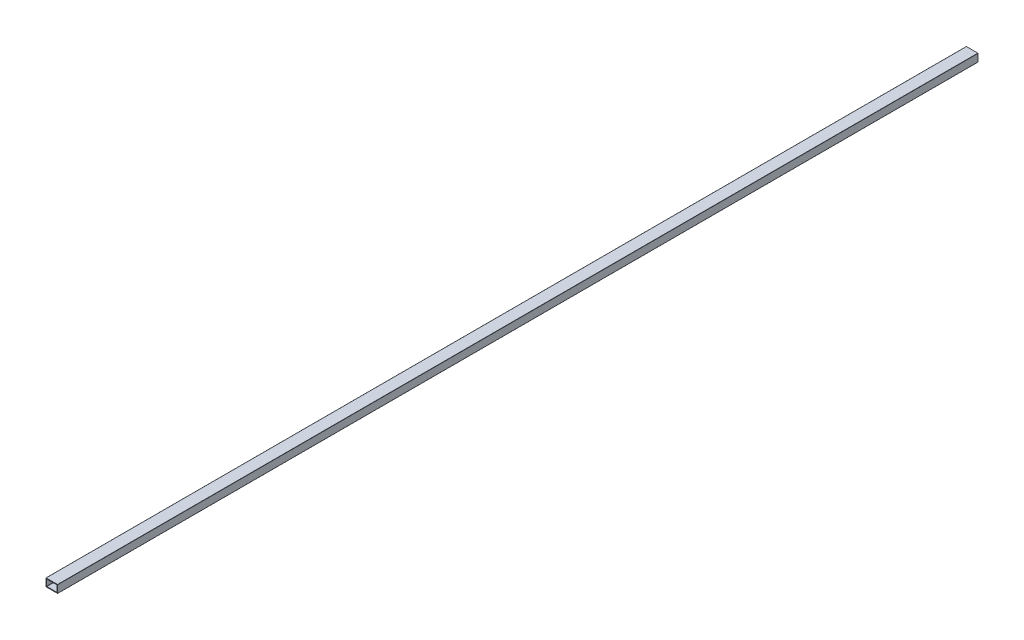
ISO-10303-21;
HEADER;
FILE_DESCRIPTION(('STEP AP214'),'2;1');
FILE_NAME('part.step','',(''),(''),'','','');
FILE_SCHEMA(('AUTOMOTIVE_DESIGN { 1 0 10303 214 1 1 1 1 }'));
ENDSEC;
DATA;
#1=APPLICATION_CONTEXT('core data for automotive mechanical design processes');
#2=APPLICATION_PROTOCOL_DEFINITION('international standard','automotive_design',2000,#1);
#3=PRODUCT_CONTEXT('',#1,'mechanical');
#4=PRODUCT('Part','Part','',(#3));
#5=PRODUCT_RELATED_PRODUCT_CATEGORY('part','',(#4));
#6=PRODUCT_DEFINITION_FORMATION('','',#4);
#7=PRODUCT_DEFINITION_CONTEXT('part definition',#1,'design');
#8=PRODUCT_DEFINITION('design','',#6,#7);
#9=PRODUCT_DEFINITION_SHAPE('','',#8);
#10=(LENGTH_UNIT() NAMED_UNIT(*) SI_UNIT(.MILLI.,.METRE.));
#11=(NAMED_UNIT(*) PLANE_ANGLE_UNIT() SI_UNIT($,.RADIAN.));
#12=(NAMED_UNIT(*) SI_UNIT($,.STERADIAN.) SOLID_ANGLE_UNIT());
#13=UNCERTAINTY_MEASURE_WITH_UNIT(LENGTH_MEASURE(1.E-05),#10,'distance_accuracy_value','');
#14=(GEOMETRIC_REPRESENTATION_CONTEXT(3) GLOBAL_UNCERTAINTY_ASSIGNED_CONTEXT((#13)) GLOBAL_UNIT_ASSIGNED_CONTEXT((#10,
#11,#12)) REPRESENTATION_CONTEXT('',''));
#15=CARTESIAN_POINT('',(0.,0.,0.));
#16=DIRECTION('',(0.,0.,1.));
#17=DIRECTION('',(1.,0.,0.));
#18=AXIS2_PLACEMENT_3D('',#15,#16,#17);
#19=CARTESIAN_POINT('',(38.1,-25.4,-6000.));
#20=DIRECTION('',(1.,0.,0.));
#21=DIRECTION('',(0.,0.,-1.));
#22=AXIS2_PLACEMENT_3D('',#19,#20,#21);
#23=PLANE('',#22);
#24=DIRECTION('',(0.,1.,0.));
#25=VECTOR('',#24,1.);
#26=CARTESIAN_POINT('',(38.1,-25.4,0.));
#27=LINE('',#26,#25);
#28=CARTESIAN_POINT('',(38.1,-24.4,0.));
#29=VERTEX_POINT('',#28);
#30=CARTESIAN_POINT('',(38.1,24.4,0.));
#31=VERTEX_POINT('',#30);
#32=EDGE_CURVE('E197',#29,#31,#27,.T.);
#33=ORIENTED_EDGE('',*,*,#32,.F.);
#34=DIRECTION('',(0.,0.,1.));
#35=VECTOR('',#34,1.);
#36=CARTESIAN_POINT('',(38.1,-24.4,-6000.));
#37=LINE('',#36,#35);
#38=CARTESIAN_POINT('',(38.1,-24.4,-6000.));
#39=VERTEX_POINT('',#38);
#40=EDGE_CURVE('E158',#29,#39,#37,.F.);
#41=ORIENTED_EDGE('',*,*,#40,.T.);
#42=DIRECTION('',(0.,1.,0.));
#43=VECTOR('',#42,1.);
#44=CARTESIAN_POINT('',(38.1,-25.4,-6000.));
#45=LINE('',#44,#43);
#46=CARTESIAN_POINT('',(38.1,24.4,-6000.));
#47=VERTEX_POINT('',#46);
#48=EDGE_CURVE('E185',#39,#47,#45,.T.);
#49=ORIENTED_EDGE('',*,*,#48,.T.);
#50=DIRECTION('',(0.,0.,1.));
#51=VECTOR('',#50,1.);
#52=CARTESIAN_POINT('',(38.1,24.4,-6000.));
#53=LINE('',#52,#51);
#54=EDGE_CURVE('E251',#47,#31,#53,.T.);
#55=ORIENTED_EDGE('',*,*,#54,.T.);
#56=EDGE_LOOP('',(#33,#41,#49,#55));
#57=FACE_BOUND('',#56,.T.);
#58=ADVANCED_FACE('F33',(#57),#23,.T.);
#59=CARTESIAN_POINT('',(-38.1,-25.4,-6000.));
#60=DIRECTION('',(0.,-1.,0.));
#61=DIRECTION('',(0.,0.,-1.));
#62=AXIS2_PLACEMENT_3D('',#59,#60,#61);
#63=PLANE('',#62);
#64=DIRECTION('',(1.,0.,0.));
#65=VECTOR('',#64,1.);
#66=CARTESIAN_POINT('',(-38.1,-25.4,0.));
#67=LINE('',#66,#65);
#68=CARTESIAN_POINT('',(-37.1,-25.4,0.));
#69=VERTEX_POINT('',#68);
#70=CARTESIAN_POINT('',(37.1,-25.4,0.));
#71=VERTEX_POINT('',#70);
#72=EDGE_CURVE('E189',#69,#71,#67,.T.);
#73=ORIENTED_EDGE('',*,*,#72,.F.);
#74=DIRECTION('',(0.,0.,1.));
#75=VECTOR('',#74,1.);
#76=CARTESIAN_POINT('',(-37.1,-25.4,-6000.));
#77=LINE('',#76,#75);
#78=CARTESIAN_POINT('',(-37.1,-25.4,-6000.));
#79=VERTEX_POINT('',#78);
#80=EDGE_CURVE('E238',#69,#79,#77,.F.);
#81=ORIENTED_EDGE('',*,*,#80,.T.);
#82=DIRECTION('',(1.,0.,0.));
#83=VECTOR('',#82,1.);
#84=CARTESIAN_POINT('',(-38.1,-25.4,-6000.));
#85=LINE('',#84,#83);
#86=CARTESIAN_POINT('',(37.1,-25.4,-6000.));
#87=VERTEX_POINT('',#86);
#88=EDGE_CURVE('E194',#79,#87,#85,.T.);
#89=ORIENTED_EDGE('',*,*,#88,.T.);
#90=DIRECTION('',(0.,0.,1.));
#91=VECTOR('',#90,1.);
#92=CARTESIAN_POINT('',(37.1,-25.4,-6000.));
#93=LINE('',#92,#91);
#94=EDGE_CURVE('E235',#87,#71,#93,.T.);
#95=ORIENTED_EDGE('',*,*,#94,.T.);
#96=EDGE_LOOP('',(#73,#81,#89,#95));
#97=FACE_BOUND('',#96,.T.);
#98=ADVANCED_FACE('F305',(#97),#63,.T.);
#99=CARTESIAN_POINT('',(-38.1,-25.4,-6000.));
#100=DIRECTION('',(-1.,0.,0.));
#101=DIRECTION('',(0.,0.,1.));
#102=AXIS2_PLACEMENT_3D('',#99,#100,#101);
#103=PLANE('',#102);
#104=DIRECTION('',(0.,-1.,0.));
#105=VECTOR('',#104,1.);
#106=CARTESIAN_POINT('',(-38.1,-25.4,-6000.));
#107=LINE('',#106,#105);
#108=CARTESIAN_POINT('',(-38.1,24.4,-6000.));
#109=VERTEX_POINT('',#108);
#110=CARTESIAN_POINT('',(-38.1,-24.4,-6000.));
#111=VERTEX_POINT('',#110);
#112=EDGE_CURVE('E191',#109,#111,#107,.T.);
#113=ORIENTED_EDGE('',*,*,#112,.T.);
#114=DIRECTION('',(0.,0.,1.));
#115=VECTOR('',#114,1.);
#116=CARTESIAN_POINT('',(-38.1,-24.4,-6000.));
#117=LINE('',#116,#115);
#118=CARTESIAN_POINT('',(-38.1,-24.4,0.));
#119=VERTEX_POINT('',#118);
#120=EDGE_CURVE('E224',#111,#119,#117,.T.);
#121=ORIENTED_EDGE('',*,*,#120,.T.);
#122=DIRECTION('',(0.,-1.,0.));
#123=VECTOR('',#122,1.);
#124=CARTESIAN_POINT('',(-38.1,-25.4,0.));
#125=LINE('',#124,#123);
#126=CARTESIAN_POINT('',(-38.1,24.4,0.));
#127=VERTEX_POINT('',#126);
#128=EDGE_CURVE('E203',#127,#119,#125,.T.);
#129=ORIENTED_EDGE('',*,*,#128,.F.);
#130=DIRECTION('',(0.,0.,1.));
#131=VECTOR('',#130,1.);
#132=CARTESIAN_POINT('',(-38.1,24.4,-6000.));
#133=LINE('',#132,#131);
#134=EDGE_CURVE('E222',#127,#109,#133,.F.);
#135=ORIENTED_EDGE('',*,*,#134,.T.);
#136=EDGE_LOOP('',(#113,#121,#129,#135));
#137=FACE_BOUND('',#136,.T.);
#138=ADVANCED_FACE('F311',(#137),#103,.T.);
#139=CARTESIAN_POINT('',(-38.1,25.4,-6000.));
#140=DIRECTION('',(0.,1.,0.));
#141=DIRECTION('',(0.,0.,1.));
#142=AXIS2_PLACEMENT_3D('',#139,#140,#141);
#143=PLANE('',#142);
#144=DIRECTION('',(-1.,0.,0.));
#145=VECTOR('',#144,1.);
#146=CARTESIAN_POINT('',(-38.1,25.4,-6000.));
#147=LINE('',#146,#145);
#148=CARTESIAN_POINT('',(37.1,25.4,-6000.));
#149=VERTEX_POINT('',#148);
#150=CARTESIAN_POINT('',(-37.1,25.4,-6000.));
#151=VERTEX_POINT('',#150);
#152=EDGE_CURVE('E188',#149,#151,#147,.T.);
#153=ORIENTED_EDGE('',*,*,#152,.T.);
#154=DIRECTION('',(0.,0.,1.));
#155=VECTOR('',#154,1.);
#156=CARTESIAN_POINT('',(-37.1,25.4,-6000.));
#157=LINE('',#156,#155);
#158=CARTESIAN_POINT('',(-37.1,25.4,0.));
#159=VERTEX_POINT('',#158);
#160=EDGE_CURVE('E248',#151,#159,#157,.T.);
#161=ORIENTED_EDGE('',*,*,#160,.T.);
#162=DIRECTION('',(-1.,0.,0.));
#163=VECTOR('',#162,1.);
#164=CARTESIAN_POINT('',(-38.1,25.4,0.));
#165=LINE('',#164,#163);
#166=CARTESIAN_POINT('',(37.1,25.4,0.));
#167=VERTEX_POINT('',#166);
#168=EDGE_CURVE('E200',#167,#159,#165,.T.);
#169=ORIENTED_EDGE('',*,*,#168,.F.);
#170=DIRECTION('',(0.,0.,1.));
#171=VECTOR('',#170,1.);
#172=CARTESIAN_POINT('',(37.1,25.4,-6000.));
#173=LINE('',#172,#171);
#174=EDGE_CURVE('E55',#167,#149,#173,.F.);
#175=ORIENTED_EDGE('',*,*,#174,.T.);
#176=EDGE_LOOP('',(#153,#161,#169,#175));
#177=FACE_BOUND('',#176,.T.);
#178=ADVANCED_FACE('F316',(#177),#143,.T.);
#179=CARTESIAN_POINT('',(0.,0.,-6000.));
#180=DIRECTION('',(0.,0.,-1.));
#181=DIRECTION('',(-1.,0.,0.));
#182=AXIS2_PLACEMENT_3D('',#179,#180,#181);
#183=PLANE('',#182);
#184=DIRECTION('',(0.,-1.,0.));
#185=VECTOR('',#184,1.);
#186=CARTESIAN_POINT('',(-33.55,-20.85,-6000.));
#187=LINE('',#186,#185);
#188=CARTESIAN_POINT('',(-33.55,19.85,-6000.));
#189=VERTEX_POINT('',#188);
#190=CARTESIAN_POINT('',(-33.55,-19.85,-6000.));
#191=VERTEX_POINT('',#190);
#192=EDGE_CURVE('E167',#189,#191,#187,.T.);
#193=ORIENTED_EDGE('',*,*,#192,.T.);
#194=CARTESIAN_POINT('',(-32.55,-19.85,-6000.));
#195=DIRECTION('',(0.,0.,-1.));
#196=DIRECTION('',(-1.,0.,0.));
#197=AXIS2_PLACEMENT_3D('',#194,#195,#196);
#198=CIRCLE('',#197,1.);
#199=CARTESIAN_POINT('',(-32.55,-20.85,-6000.));
#200=VERTEX_POINT('',#199);
#201=EDGE_CURVE('E11',#191,#200,#198,.F.);
#202=ORIENTED_EDGE('',*,*,#201,.T.);
#203=DIRECTION('',(1.,0.,0.));
#204=VECTOR('',#203,1.);
#205=CARTESIAN_POINT('',(-33.55,-20.85,-6000.));
#206=LINE('',#205,#204);
#207=CARTESIAN_POINT('',(32.55,-20.85,-6000.));
#208=VERTEX_POINT('',#207);
#209=EDGE_CURVE('E175',#200,#208,#206,.T.);
#210=ORIENTED_EDGE('',*,*,#209,.T.);
#211=CARTESIAN_POINT('',(32.55,-19.85,-6000.));
#212=DIRECTION('',(0.,0.,-1.));
#213=DIRECTION('',(-1.,0.,0.));
#214=AXIS2_PLACEMENT_3D('',#211,#212,#213);
#215=CIRCLE('',#214,1.);
#216=CARTESIAN_POINT('',(33.55,-19.85,-6000.));
#217=VERTEX_POINT('',#216);
#218=EDGE_CURVE('E262',#208,#217,#215,.F.);
#219=ORIENTED_EDGE('',*,*,#218,.T.);
#220=DIRECTION('',(0.,1.,0.));
#221=VECTOR('',#220,1.);
#222=CARTESIAN_POINT('',(33.55,-20.85,-6000.));
#223=LINE('',#222,#221);
#224=CARTESIAN_POINT('',(33.55,19.85,-6000.));
#225=VERTEX_POINT('',#224);
#226=EDGE_CURVE('E179',#217,#225,#223,.T.);
#227=ORIENTED_EDGE('',*,*,#226,.T.);
#228=CARTESIAN_POINT('',(32.55,19.85,-6000.));
#229=DIRECTION('',(0.,0.,-1.));
#230=DIRECTION('',(-1.,0.,0.));
#231=AXIS2_PLACEMENT_3D('',#228,#229,#230);
#232=CIRCLE('',#231,1.);
#233=CARTESIAN_POINT('',(32.55,20.85,-6000.));
#234=VERTEX_POINT('',#233);
#235=EDGE_CURVE('E258',#225,#234,#232,.F.);
#236=ORIENTED_EDGE('',*,*,#235,.T.);
#237=DIRECTION('',(-1.,0.,0.));
#238=VECTOR('',#237,1.);
#239=CARTESIAN_POINT('',(-33.55,20.85,-6000.));
#240=LINE('',#239,#238);
#241=CARTESIAN_POINT('',(-32.55,20.85,-6000.));
#242=VERTEX_POINT('',#241);
#243=EDGE_CURVE('E277',#234,#242,#240,.T.);
#244=ORIENTED_EDGE('',*,*,#243,.T.);
#245=CARTESIAN_POINT('',(-32.55,19.85,-6000.));
#246=DIRECTION('',(0.,0.,-1.));
#247=DIRECTION('',(-1.,0.,0.));
#248=AXIS2_PLACEMENT_3D('',#245,#246,#247);
#249=CIRCLE('',#248,1.);
#250=EDGE_CURVE('E157',#242,#189,#249,.F.);
#251=ORIENTED_EDGE('',*,*,#250,.T.);
#252=EDGE_LOOP('',(#193,#202,#210,#219,#227,#236,#244,#251));
#253=FACE_BOUND('',#252,.T.);
#254=ORIENTED_EDGE('',*,*,#88,.F.);
#255=CARTESIAN_POINT('',(-37.1,-24.4,-6000.));
#256=DIRECTION('',(0.,0.,-1.));
#257=DIRECTION('',(-1.,0.,0.));
#258=AXIS2_PLACEMENT_3D('',#255,#256,#257);
#259=CIRCLE('',#258,1.);
#260=EDGE_CURVE('E245',#79,#111,#259,.T.);
#261=ORIENTED_EDGE('',*,*,#260,.T.);
#262=ORIENTED_EDGE('',*,*,#112,.F.);
#263=CARTESIAN_POINT('',(-37.1,24.4,-6000.));
#264=DIRECTION('',(0.,0.,-1.));
#265=DIRECTION('',(-1.,0.,0.));
#266=AXIS2_PLACEMENT_3D('',#263,#264,#265);
#267=CIRCLE('',#266,1.);
#268=EDGE_CURVE('E48',#109,#151,#267,.T.);
#269=ORIENTED_EDGE('',*,*,#268,.T.);
#270=ORIENTED_EDGE('',*,*,#152,.F.);
#271=CARTESIAN_POINT('',(37.1,24.4,-6000.));
#272=DIRECTION('',(0.,0.,-1.));
#273=DIRECTION('',(-1.,0.,0.));
#274=AXIS2_PLACEMENT_3D('',#271,#272,#273);
#275=CIRCLE('',#274,1.);
#276=EDGE_CURVE('E240',#149,#47,#275,.T.);
#277=ORIENTED_EDGE('',*,*,#276,.T.);
#278=ORIENTED_EDGE('',*,*,#48,.F.);
#279=CARTESIAN_POINT('',(37.1,-24.4,-6000.));
#280=DIRECTION('',(0.,0.,-1.));
#281=DIRECTION('',(-1.,0.,0.));
#282=AXIS2_PLACEMENT_3D('',#279,#280,#281);
#283=CIRCLE('',#282,1.);
#284=EDGE_CURVE('E242',#39,#87,#283,.T.);
#285=ORIENTED_EDGE('',*,*,#284,.T.);
#286=EDGE_LOOP('',(#254,#261,#262,#269,#270,#277,#278,#285));
#287=FACE_BOUND('',#286,.T.);
#288=ADVANCED_FACE('F267',(#253,#287),#183,.T.);
#289=CARTESIAN_POINT('',(0.,0.,0.));
#290=DIRECTION('',(0.,0.,-1.));
#291=DIRECTION('',(-1.,0.,0.));
#292=AXIS2_PLACEMENT_3D('',#289,#290,#291);
#293=PLANE('',#292);
#294=DIRECTION('',(0.,1.,0.));
#295=VECTOR('',#294,1.);
#296=CARTESIAN_POINT('',(33.55,-20.85,0.));
#297=LINE('',#296,#295);
#298=CARTESIAN_POINT('',(33.55,-19.85,0.));
#299=VERTEX_POINT('',#298);
#300=CARTESIAN_POINT('',(33.55,19.85,0.));
#301=VERTEX_POINT('',#300);
#302=EDGE_CURVE('E181',#299,#301,#297,.T.);
#303=ORIENTED_EDGE('',*,*,#302,.F.);
#304=CARTESIAN_POINT('',(32.55,-19.85,0.));
#305=DIRECTION('',(0.,0.,-1.));
#306=DIRECTION('',(-1.,0.,0.));
#307=AXIS2_PLACEMENT_3D('',#304,#305,#306);
#308=CIRCLE('',#307,1.);
#309=CARTESIAN_POINT('',(32.55,-20.85,0.));
#310=VERTEX_POINT('',#309);
#311=EDGE_CURVE('E260',#299,#310,#308,.T.);
#312=ORIENTED_EDGE('',*,*,#311,.T.);
#313=DIRECTION('',(1.,0.,0.));
#314=VECTOR('',#313,1.);
#315=CARTESIAN_POINT('',(-33.55,-20.85,0.));
#316=LINE('',#315,#314);
#317=CARTESIAN_POINT('',(-32.55,-20.85,0.));
#318=VERTEX_POINT('',#317);
#319=EDGE_CURVE('E281',#318,#310,#316,.T.);
#320=ORIENTED_EDGE('',*,*,#319,.F.);
#321=CARTESIAN_POINT('',(-32.55,-19.85,0.));
#322=DIRECTION('',(0.,0.,-1.));
#323=DIRECTION('',(-1.,0.,0.));
#324=AXIS2_PLACEMENT_3D('',#321,#322,#323);
#325=CIRCLE('',#324,1.);
#326=CARTESIAN_POINT('',(-33.55,-19.85,0.));
#327=VERTEX_POINT('',#326);
#328=EDGE_CURVE('E41',#318,#327,#325,.T.);
#329=ORIENTED_EDGE('',*,*,#328,.T.);
#330=DIRECTION('',(0.,-1.,0.));
#331=VECTOR('',#330,1.);
#332=CARTESIAN_POINT('',(-33.55,-20.85,0.));
#333=LINE('',#332,#331);
#334=CARTESIAN_POINT('',(-33.55,19.85,0.));
#335=VERTEX_POINT('',#334);
#336=EDGE_CURVE('E164',#335,#327,#333,.T.);
#337=ORIENTED_EDGE('',*,*,#336,.F.);
#338=CARTESIAN_POINT('',(-32.55,19.85,0.));
#339=DIRECTION('',(0.,0.,-1.));
#340=DIRECTION('',(-1.,0.,0.));
#341=AXIS2_PLACEMENT_3D('',#338,#339,#340);
#342=CIRCLE('',#341,1.);
#343=CARTESIAN_POINT('',(-32.55,20.85,0.));
#344=VERTEX_POINT('',#343);
#345=EDGE_CURVE('E147',#335,#344,#342,.T.);
#346=ORIENTED_EDGE('',*,*,#345,.T.);
#347=DIRECTION('',(-1.,0.,0.));
#348=VECTOR('',#347,1.);
#349=CARTESIAN_POINT('',(-33.55,20.85,0.));
#350=LINE('',#349,#348);
#351=CARTESIAN_POINT('',(32.55,20.85,0.));
#352=VERTEX_POINT('',#351);
#353=EDGE_CURVE('E176',#352,#344,#350,.T.);
#354=ORIENTED_EDGE('',*,*,#353,.F.);
#355=CARTESIAN_POINT('',(32.55,19.85,0.));
#356=DIRECTION('',(0.,0.,-1.));
#357=DIRECTION('',(-1.,0.,0.));
#358=AXIS2_PLACEMENT_3D('',#355,#356,#357);
#359=CIRCLE('',#358,1.);
#360=EDGE_CURVE('E256',#352,#301,#359,.T.);
#361=ORIENTED_EDGE('',*,*,#360,.T.);
#362=EDGE_LOOP('',(#303,#312,#320,#329,#337,#346,#354,#361));
#363=FACE_BOUND('',#362,.T.);
#364=ORIENTED_EDGE('',*,*,#128,.T.);
#365=CARTESIAN_POINT('',(-37.1,-24.4,0.));
#366=DIRECTION('',(0.,0.,-1.));
#367=DIRECTION('',(-1.,0.,0.));
#368=AXIS2_PLACEMENT_3D('',#365,#366,#367);
#369=CIRCLE('',#368,1.);
#370=EDGE_CURVE('E233',#119,#69,#369,.F.);
#371=ORIENTED_EDGE('',*,*,#370,.T.);
#372=ORIENTED_EDGE('',*,*,#72,.T.);
#373=CARTESIAN_POINT('',(37.1,-24.4,0.));
#374=DIRECTION('',(0.,0.,-1.));
#375=DIRECTION('',(-1.,0.,0.));
#376=AXIS2_PLACEMENT_3D('',#373,#374,#375);
#377=CIRCLE('',#376,1.);
#378=EDGE_CURVE('E229',#71,#29,#377,.F.);
#379=ORIENTED_EDGE('',*,*,#378,.T.);
#380=ORIENTED_EDGE('',*,*,#32,.T.);
#381=CARTESIAN_POINT('',(37.1,24.4,0.));
#382=DIRECTION('',(0.,0.,-1.));
#383=DIRECTION('',(-1.,0.,0.));
#384=AXIS2_PLACEMENT_3D('',#381,#382,#383);
#385=CIRCLE('',#384,1.);
#386=EDGE_CURVE('E227',#31,#167,#385,.F.);
#387=ORIENTED_EDGE('',*,*,#386,.T.);
#388=ORIENTED_EDGE('',*,*,#168,.T.);
#389=CARTESIAN_POINT('',(-37.1,24.4,0.));
#390=DIRECTION('',(0.,0.,-1.));
#391=DIRECTION('',(-1.,0.,0.));
#392=AXIS2_PLACEMENT_3D('',#389,#390,#391);
#393=CIRCLE('',#392,1.);
#394=EDGE_CURVE('E231',#159,#127,#393,.F.);
#395=ORIENTED_EDGE('',*,*,#394,.T.);
#396=EDGE_LOOP('',(#364,#371,#372,#379,#380,#387,#388,#395));
#397=FACE_BOUND('',#396,.T.);
#398=ADVANCED_FACE('F172',(#363,#397),#293,.F.);
#399=CARTESIAN_POINT('',(-33.55,-20.85,-6000.));
#400=DIRECTION('',(0.,-1.,0.));
#401=DIRECTION('',(0.,0.,-1.));
#402=AXIS2_PLACEMENT_3D('',#399,#400,#401);
#403=PLANE('',#402);
#404=ORIENTED_EDGE('',*,*,#319,.T.);
#405=DIRECTION('',(0.,0.,1.));
#406=VECTOR('',#405,1.);
#407=CARTESIAN_POINT('',(32.55,-20.85,-6000.));
#408=LINE('',#407,#406);
#409=EDGE_CURVE('E220',#310,#208,#408,.F.);
#410=ORIENTED_EDGE('',*,*,#409,.T.);
#411=ORIENTED_EDGE('',*,*,#209,.F.);
#412=DIRECTION('',(0.,0.,1.));
#413=VECTOR('',#412,1.);
#414=CARTESIAN_POINT('',(-32.55,-20.85,0.));
#415=LINE('',#414,#413);
#416=EDGE_CURVE('E217',#200,#318,#415,.T.);
#417=ORIENTED_EDGE('',*,*,#416,.T.);
#418=EDGE_LOOP('',(#404,#410,#411,#417));
#419=FACE_BOUND('',#418,.T.);
#420=ADVANCED_FACE('F283',(#419),#403,.F.);
#421=CARTESIAN_POINT('',(-33.55,-20.85,-6000.));
#422=DIRECTION('',(-1.,0.,0.));
#423=DIRECTION('',(0.,0.,1.));
#424=AXIS2_PLACEMENT_3D('',#421,#422,#423);
#425=PLANE('',#424);
#426=ORIENTED_EDGE('',*,*,#192,.F.);
#427=DIRECTION('',(0.,0.,1.));
#428=VECTOR('',#427,1.);
#429=CARTESIAN_POINT('',(-33.55,19.85,0.));
#430=LINE('',#429,#428);
#431=EDGE_CURVE('E151',#189,#335,#430,.T.);
#432=ORIENTED_EDGE('',*,*,#431,.T.);
#433=ORIENTED_EDGE('',*,*,#336,.T.);
#434=DIRECTION('',(0.,0.,1.));
#435=VECTOR('',#434,1.);
#436=CARTESIAN_POINT('',(-33.55,-19.85,-6000.));
#437=LINE('',#436,#435);
#438=EDGE_CURVE('E169',#327,#191,#437,.F.);
#439=ORIENTED_EDGE('',*,*,#438,.T.);
#440=EDGE_LOOP('',(#426,#432,#433,#439));
#441=FACE_BOUND('',#440,.T.);
#442=ADVANCED_FACE('F163',(#441),#425,.F.);
#443=CARTESIAN_POINT('',(-33.55,20.85,-6000.));
#444=DIRECTION('',(0.,1.,0.));
#445=DIRECTION('',(0.,0.,1.));
#446=AXIS2_PLACEMENT_3D('',#443,#444,#445);
#447=PLANE('',#446);
#448=ORIENTED_EDGE('',*,*,#353,.T.);
#449=DIRECTION('',(0.,0.,1.));
#450=VECTOR('',#449,1.);
#451=CARTESIAN_POINT('',(-32.55,20.85,-6000.));
#452=LINE('',#451,#450);
#453=EDGE_CURVE('E152',#344,#242,#452,.F.);
#454=ORIENTED_EDGE('',*,*,#453,.T.);
#455=ORIENTED_EDGE('',*,*,#243,.F.);
#456=DIRECTION('',(0.,0.,1.));
#457=VECTOR('',#456,1.);
#458=CARTESIAN_POINT('',(32.55,20.85,0.));
#459=LINE('',#458,#457);
#460=EDGE_CURVE('E168',#234,#352,#459,.T.);
#461=ORIENTED_EDGE('',*,*,#460,.T.);
#462=EDGE_LOOP('',(#448,#454,#455,#461));
#463=FACE_BOUND('',#462,.T.);
#464=ADVANCED_FACE('F292',(#463),#447,.F.);
#465=CARTESIAN_POINT('',(33.55,-20.85,-6000.));
#466=DIRECTION('',(1.,0.,0.));
#467=DIRECTION('',(0.,0.,-1.));
#468=AXIS2_PLACEMENT_3D('',#465,#466,#467);
#469=PLANE('',#468);
#470=ORIENTED_EDGE('',*,*,#302,.T.);
#471=DIRECTION('',(0.,0.,1.));
#472=VECTOR('',#471,1.);
#473=CARTESIAN_POINT('',(33.55,19.85,-6000.));
#474=LINE('',#473,#472);
#475=EDGE_CURVE('E215',#301,#225,#474,.F.);
#476=ORIENTED_EDGE('',*,*,#475,.T.);
#477=ORIENTED_EDGE('',*,*,#226,.F.);
#478=DIRECTION('',(0.,0.,1.));
#479=VECTOR('',#478,1.);
#480=CARTESIAN_POINT('',(33.55,-19.85,0.));
#481=LINE('',#480,#479);
#482=EDGE_CURVE('E212',#217,#299,#481,.T.);
#483=ORIENTED_EDGE('',*,*,#482,.T.);
#484=EDGE_LOOP('',(#470,#476,#477,#483));
#485=FACE_BOUND('',#484,.T.);
#486=ADVANCED_FACE('F275',(#485),#469,.F.);
#487=CARTESIAN_POINT('',(-32.55,19.85,-6000.));
#488=DIRECTION('',(0.,0.,-1.));
#489=DIRECTION('',(-1.,0.,0.));
#490=AXIS2_PLACEMENT_3D('',#487,#488,#489);
#491=CYLINDRICAL_SURFACE('',#490,1.);
#492=ORIENTED_EDGE('',*,*,#250,.F.);
#493=ORIENTED_EDGE('',*,*,#453,.F.);
#494=ORIENTED_EDGE('',*,*,#345,.F.);
#495=ORIENTED_EDGE('',*,*,#431,.F.);
#496=EDGE_LOOP('',(#492,#493,#494,#495));
#497=FACE_BOUND('',#496,.T.);
#498=ADVANCED_FACE('F150',(#497),#491,.F.);
#499=CARTESIAN_POINT('',(32.55,19.85,-6000.));
#500=DIRECTION('',(0.,0.,-1.));
#501=DIRECTION('',(-1.,0.,0.));
#502=AXIS2_PLACEMENT_3D('',#499,#500,#501);
#503=CYLINDRICAL_SURFACE('',#502,1.);
#504=ORIENTED_EDGE('',*,*,#235,.F.);
#505=ORIENTED_EDGE('',*,*,#475,.F.);
#506=ORIENTED_EDGE('',*,*,#360,.F.);
#507=ORIENTED_EDGE('',*,*,#460,.F.);
#508=EDGE_LOOP('',(#504,#505,#506,#507));
#509=FACE_BOUND('',#508,.T.);
#510=ADVANCED_FACE('F294',(#509),#503,.F.);
#511=CARTESIAN_POINT('',(32.55,-19.85,-6000.));
#512=DIRECTION('',(0.,0.,-1.));
#513=DIRECTION('',(-1.,0.,0.));
#514=AXIS2_PLACEMENT_3D('',#511,#512,#513);
#515=CYLINDRICAL_SURFACE('',#514,1.);
#516=ORIENTED_EDGE('',*,*,#218,.F.);
#517=ORIENTED_EDGE('',*,*,#409,.F.);
#518=ORIENTED_EDGE('',*,*,#311,.F.);
#519=ORIENTED_EDGE('',*,*,#482,.F.);
#520=EDGE_LOOP('',(#516,#517,#518,#519));
#521=FACE_BOUND('',#520,.T.);
#522=ADVANCED_FACE('F279',(#521),#515,.F.);
#523=CARTESIAN_POINT('',(-37.1,-24.4,-6000.));
#524=DIRECTION('',(0.,0.,1.));
#525=DIRECTION('',(1.,0.,0.));
#526=AXIS2_PLACEMENT_3D('',#523,#524,#525);
#527=CYLINDRICAL_SURFACE('',#526,1.);
#528=ORIENTED_EDGE('',*,*,#260,.F.);
#529=ORIENTED_EDGE('',*,*,#80,.F.);
#530=ORIENTED_EDGE('',*,*,#370,.F.);
#531=ORIENTED_EDGE('',*,*,#120,.F.);
#532=EDGE_LOOP('',(#528,#529,#530,#531));
#533=FACE_BOUND('',#532,.T.);
#534=ADVANCED_FACE('F301',(#533),#527,.T.);
#535=CARTESIAN_POINT('',(-37.1,24.4,-6000.));
#536=DIRECTION('',(0.,0.,1.));
#537=DIRECTION('',(1.,0.,0.));
#538=AXIS2_PLACEMENT_3D('',#535,#536,#537);
#539=CYLINDRICAL_SURFACE('',#538,1.);
#540=ORIENTED_EDGE('',*,*,#268,.F.);
#541=ORIENTED_EDGE('',*,*,#134,.F.);
#542=ORIENTED_EDGE('',*,*,#394,.F.);
#543=ORIENTED_EDGE('',*,*,#160,.F.);
#544=EDGE_LOOP('',(#540,#541,#542,#543));
#545=FACE_BOUND('',#544,.T.);
#546=ADVANCED_FACE('F368',(#545),#539,.T.);
#547=CARTESIAN_POINT('',(-32.55,-19.85,-6000.));
#548=DIRECTION('',(0.,0.,-1.));
#549=DIRECTION('',(-1.,0.,0.));
#550=AXIS2_PLACEMENT_3D('',#547,#548,#549);
#551=CYLINDRICAL_SURFACE('',#550,1.);
#552=ORIENTED_EDGE('',*,*,#201,.F.);
#553=ORIENTED_EDGE('',*,*,#438,.F.);
#554=ORIENTED_EDGE('',*,*,#328,.F.);
#555=ORIENTED_EDGE('',*,*,#416,.F.);
#556=EDGE_LOOP('',(#552,#553,#554,#555));
#557=FACE_BOUND('',#556,.T.);
#558=ADVANCED_FACE('F378',(#557),#551,.F.);
#559=CARTESIAN_POINT('',(37.1,-24.4,-6000.));
#560=DIRECTION('',(0.,0.,1.));
#561=DIRECTION('',(1.,0.,0.));
#562=AXIS2_PLACEMENT_3D('',#559,#560,#561);
#563=CYLINDRICAL_SURFACE('',#562,1.);
#564=ORIENTED_EDGE('',*,*,#284,.F.);
#565=ORIENTED_EDGE('',*,*,#40,.F.);
#566=ORIENTED_EDGE('',*,*,#378,.F.);
#567=ORIENTED_EDGE('',*,*,#94,.F.);
#568=EDGE_LOOP('',(#564,#565,#566,#567));
#569=FACE_BOUND('',#568,.T.);
#570=ADVANCED_FACE('F388',(#569),#563,.T.);
#571=CARTESIAN_POINT('',(37.1,24.4,-6000.));
#572=DIRECTION('',(0.,0.,1.));
#573=DIRECTION('',(1.,0.,0.));
#574=AXIS2_PLACEMENT_3D('',#571,#572,#573);
#575=CYLINDRICAL_SURFACE('',#574,1.);
#576=ORIENTED_EDGE('',*,*,#276,.F.);
#577=ORIENTED_EDGE('',*,*,#174,.F.);
#578=ORIENTED_EDGE('',*,*,#386,.F.);
#579=ORIENTED_EDGE('',*,*,#54,.F.);
#580=EDGE_LOOP('',(#576,#577,#578,#579));
#581=FACE_BOUND('',#580,.T.);
#582=ADVANCED_FACE('F35',(#581),#575,.T.);
#583=CLOSED_SHELL('',(#58,#98,#138,#178,#288,#398,#420,#442,#464,#486,#498,#510,#522,#534,#546,
#558,#570,#582));
#584=MANIFOLD_SOLID_BREP('B2',#583);
#585=ADVANCED_BREP_SHAPE_REPRESENTATION('',(#18,#584),#14);
#586=SHAPE_DEFINITION_REPRESENTATION(#9,#585);
ENDSEC;
END-ISO-10303-21;
